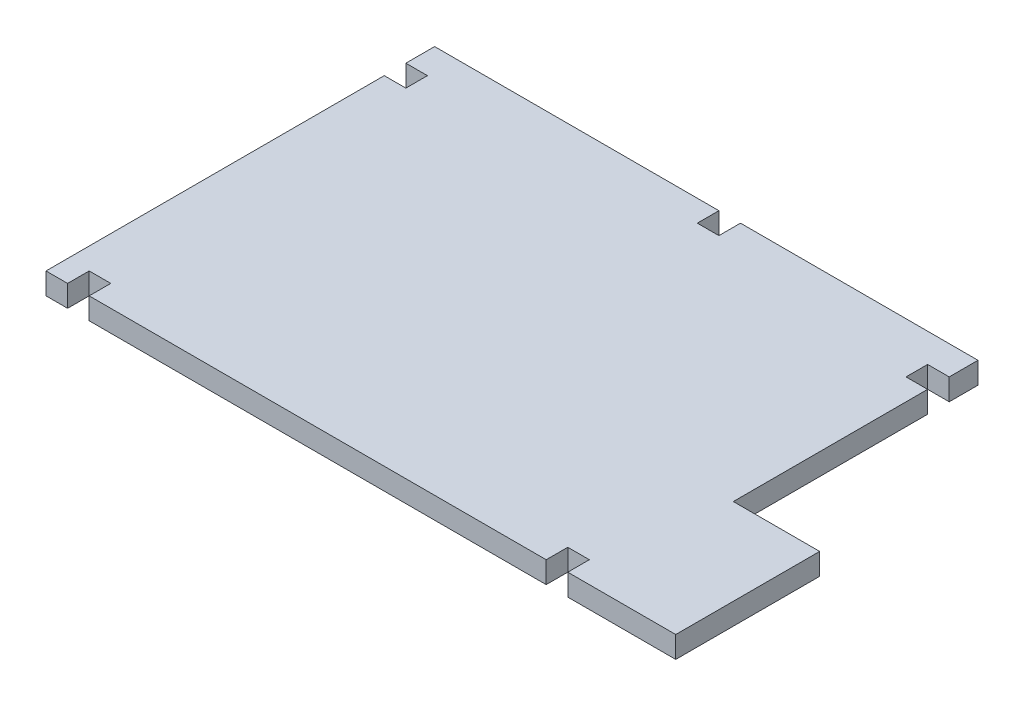
ISO-10303-21;
HEADER;
FILE_DESCRIPTION(('STEP AP214'),'2;1');
FILE_NAME('part.step','',(''),(''),'','','');
FILE_SCHEMA(('AUTOMOTIVE_DESIGN { 1 0 10303 214 1 1 1 1 }'));
ENDSEC;
DATA;
#1=APPLICATION_CONTEXT('core data for automotive mechanical design processes');
#2=APPLICATION_PROTOCOL_DEFINITION('international standard','automotive_design',2000,#1);
#3=PRODUCT_CONTEXT('',#1,'mechanical');
#4=PRODUCT('Part','Part','',(#3));
#5=PRODUCT_RELATED_PRODUCT_CATEGORY('part','',(#4));
#6=PRODUCT_DEFINITION_FORMATION('','',#4);
#7=PRODUCT_DEFINITION_CONTEXT('part definition',#1,'design');
#8=PRODUCT_DEFINITION('design','',#6,#7);
#9=PRODUCT_DEFINITION_SHAPE('','',#8);
#10=(LENGTH_UNIT() NAMED_UNIT(*) SI_UNIT(.MILLI.,.METRE.));
#11=(NAMED_UNIT(*) PLANE_ANGLE_UNIT() SI_UNIT($,.RADIAN.));
#12=(NAMED_UNIT(*) SI_UNIT($,.STERADIAN.) SOLID_ANGLE_UNIT());
#13=UNCERTAINTY_MEASURE_WITH_UNIT(LENGTH_MEASURE(1.E-05),#10,'distance_accuracy_value','');
#14=(GEOMETRIC_REPRESENTATION_CONTEXT(3) GLOBAL_UNCERTAINTY_ASSIGNED_CONTEXT((#13)) GLOBAL_UNIT_ASSIGNED_CONTEXT((#10,
#11,#12)) REPRESENTATION_CONTEXT('',''));
#15=CARTESIAN_POINT('',(0.,0.,0.));
#16=DIRECTION('',(0.,0.,1.));
#17=DIRECTION('',(1.,0.,0.));
#18=AXIS2_PLACEMENT_3D('',#15,#16,#17);
#19=CARTESIAN_POINT('',(-67.3129290115456,3.,-27.6037890560293));
#20=DIRECTION('',(0.,0.,1.));
#21=DIRECTION('',(1.,0.,0.));
#22=AXIS2_PLACEMENT_3D('',#19,#20,#21);
#23=PLANE('',#22);
#24=DIRECTION('',(-1.,0.,0.));
#25=VECTOR('',#24,1.);
#26=CARTESIAN_POINT('',(-67.3129290115456,0.,-27.6037890560293));
#27=LINE('',#26,#25);
#28=CARTESIAN_POINT('',(-27.8129290115456,0.,-27.6037890560293));
#29=VERTEX_POINT('',#28);
#30=CARTESIAN_POINT('',(-67.3129290115456,0.,-27.6037890560293));
#31=VERTEX_POINT('',#30);
#32=EDGE_CURVE('E244',#29,#31,#27,.T.);
#33=ORIENTED_EDGE('',*,*,#32,.T.);
#34=DIRECTION('',(0.,-1.,0.));
#35=VECTOR('',#34,1.);
#36=CARTESIAN_POINT('',(-67.3129290115456,3.,-27.6037890560293));
#37=LINE('',#36,#35);
#38=CARTESIAN_POINT('',(-67.3129290115456,3.,-27.6037890560293));
#39=VERTEX_POINT('',#38);
#40=EDGE_CURVE('E11',#39,#31,#37,.T.);
#41=ORIENTED_EDGE('',*,*,#40,.F.);
#42=DIRECTION('',(-1.,0.,0.));
#43=VECTOR('',#42,1.);
#44=CARTESIAN_POINT('',(-67.3129290115456,3.,-27.6037890560293));
#45=LINE('',#44,#43);
#46=CARTESIAN_POINT('',(-27.8129290115456,3.,-27.6037890560293));
#47=VERTEX_POINT('',#46);
#48=EDGE_CURVE('E293',#47,#39,#45,.T.);
#49=ORIENTED_EDGE('',*,*,#48,.F.);
#50=DIRECTION('',(0.,-1.,0.));
#51=VECTOR('',#50,1.);
#52=CARTESIAN_POINT('',(-27.8129290115456,3.,-27.6037890560293));
#53=LINE('',#52,#51);
#54=EDGE_CURVE('E241',#47,#29,#53,.T.);
#55=ORIENTED_EDGE('',*,*,#54,.T.);
#56=EDGE_LOOP('',(#33,#41,#49,#55));
#57=FACE_BOUND('',#56,.T.);
#58=ADVANCED_FACE('F41',(#57),#23,.F.);
#59=CARTESIAN_POINT('',(-67.3129290115456,3.,-27.6037890560293));
#60=DIRECTION('',(1.,0.,0.));
#61=DIRECTION('',(0.,0.,-1.));
#62=AXIS2_PLACEMENT_3D('',#59,#60,#61);
#63=PLANE('',#62);
#64=DIRECTION('',(0.,0.,1.));
#65=VECTOR('',#64,1.);
#66=CARTESIAN_POINT('',(-67.3129290115456,0.,-27.6037890560293));
#67=LINE('',#66,#65);
#68=CARTESIAN_POINT('',(-67.3129290115456,0.,-23.6037890560293));
#69=VERTEX_POINT('',#68);
#70=EDGE_CURVE('E250',#31,#69,#67,.T.);
#71=ORIENTED_EDGE('',*,*,#70,.T.);
#72=DIRECTION('',(0.,-1.,0.));
#73=VECTOR('',#72,1.);
#74=CARTESIAN_POINT('',(-67.3129290115456,3.,-23.6037890560293));
#75=LINE('',#74,#73);
#76=CARTESIAN_POINT('',(-67.3129290115456,3.,-23.6037890560293));
#77=VERTEX_POINT('',#76);
#78=EDGE_CURVE('E47',#77,#69,#75,.T.);
#79=ORIENTED_EDGE('',*,*,#78,.F.);
#80=DIRECTION('',(0.,0.,1.));
#81=VECTOR('',#80,1.);
#82=CARTESIAN_POINT('',(-67.3129290115456,3.,-27.6037890560293));
#83=LINE('',#82,#81);
#84=EDGE_CURVE('E152',#39,#77,#83,.T.);
#85=ORIENTED_EDGE('',*,*,#84,.F.);
#86=ORIENTED_EDGE('',*,*,#40,.T.);
#87=EDGE_LOOP('',(#71,#79,#85,#86));
#88=FACE_BOUND('',#87,.T.);
#89=ADVANCED_FACE('F444',(#88),#63,.F.);
#90=CARTESIAN_POINT('',(-67.3129290115456,3.,-23.6037890560293));
#91=DIRECTION('',(0.,0.,-1.));
#92=DIRECTION('',(-1.,0.,0.));
#93=AXIS2_PLACEMENT_3D('',#90,#91,#92);
#94=PLANE('',#93);
#95=DIRECTION('',(1.,0.,0.));
#96=VECTOR('',#95,1.);
#97=CARTESIAN_POINT('',(-67.3129290115456,0.,-23.6037890560293));
#98=LINE('',#97,#96);
#99=CARTESIAN_POINT('',(-64.3129290115456,0.,-23.6037890560293));
#100=VERTEX_POINT('',#99);
#101=EDGE_CURVE('E248',#69,#100,#98,.T.);
#102=ORIENTED_EDGE('',*,*,#101,.T.);
#103=DIRECTION('',(0.,-1.,0.));
#104=VECTOR('',#103,1.);
#105=CARTESIAN_POINT('',(-64.3129290115456,3.,-23.6037890560293));
#106=LINE('',#105,#104);
#107=CARTESIAN_POINT('',(-64.3129290115456,3.,-23.6037890560293));
#108=VERTEX_POINT('',#107);
#109=EDGE_CURVE('E357',#108,#100,#106,.T.);
#110=ORIENTED_EDGE('',*,*,#109,.F.);
#111=DIRECTION('',(1.,0.,0.));
#112=VECTOR('',#111,1.);
#113=CARTESIAN_POINT('',(-67.3129290115456,3.,-23.6037890560293));
#114=LINE('',#113,#112);
#115=EDGE_CURVE('E365',#77,#108,#114,.T.);
#116=ORIENTED_EDGE('',*,*,#115,.F.);
#117=ORIENTED_EDGE('',*,*,#78,.T.);
#118=EDGE_LOOP('',(#102,#110,#116,#117));
#119=FACE_BOUND('',#118,.T.);
#120=ADVANCED_FACE('F362',(#119),#94,.F.);
#121=CARTESIAN_POINT('',(-64.3129290115456,3.,-23.6037890560293));
#122=DIRECTION('',(1.,0.,0.));
#123=DIRECTION('',(0.,0.,-1.));
#124=AXIS2_PLACEMENT_3D('',#121,#122,#123);
#125=PLANE('',#124);
#126=DIRECTION('',(0.,0.,1.));
#127=VECTOR('',#126,1.);
#128=CARTESIAN_POINT('',(-64.3129290115456,0.,-23.6037890560293));
#129=LINE('',#128,#127);
#130=CARTESIAN_POINT('',(-64.3129290115456,0.,-20.6037890560293));
#131=VERTEX_POINT('',#130);
#132=EDGE_CURVE('E252',#100,#131,#129,.T.);
#133=ORIENTED_EDGE('',*,*,#132,.T.);
#134=DIRECTION('',(0.,-1.,0.));
#135=VECTOR('',#134,1.);
#136=CARTESIAN_POINT('',(-64.3129290115456,3.,-20.6037890560293));
#137=LINE('',#136,#135);
#138=CARTESIAN_POINT('',(-64.3129290115456,3.,-20.6037890560293));
#139=VERTEX_POINT('',#138);
#140=EDGE_CURVE('E352',#139,#131,#137,.T.);
#141=ORIENTED_EDGE('',*,*,#140,.F.);
#142=DIRECTION('',(0.,0.,1.));
#143=VECTOR('',#142,1.);
#144=CARTESIAN_POINT('',(-64.3129290115456,3.,-23.6037890560293));
#145=LINE('',#144,#143);
#146=EDGE_CURVE('E385',#108,#139,#145,.T.);
#147=ORIENTED_EDGE('',*,*,#146,.F.);
#148=ORIENTED_EDGE('',*,*,#109,.T.);
#149=EDGE_LOOP('',(#133,#141,#147,#148));
#150=FACE_BOUND('',#149,.T.);
#151=ADVANCED_FACE('F373',(#150),#125,.F.);
#152=CARTESIAN_POINT('',(-64.3129290115456,3.,-20.6037890560293));
#153=DIRECTION('',(0.,0.,1.));
#154=DIRECTION('',(1.,0.,0.));
#155=AXIS2_PLACEMENT_3D('',#152,#153,#154);
#156=PLANE('',#155);
#157=DIRECTION('',(-1.,0.,0.));
#158=VECTOR('',#157,1.);
#159=CARTESIAN_POINT('',(-64.3129290115456,0.,-20.6037890560293));
#160=LINE('',#159,#158);
#161=CARTESIAN_POINT('',(-67.3129290115456,0.,-20.6037890560293));
#162=VERTEX_POINT('',#161);
#163=EDGE_CURVE('E255',#131,#162,#160,.T.);
#164=ORIENTED_EDGE('',*,*,#163,.T.);
#165=DIRECTION('',(0.,-1.,0.));
#166=VECTOR('',#165,1.);
#167=CARTESIAN_POINT('',(-67.3129290115456,3.,-20.6037890560293));
#168=LINE('',#167,#166);
#169=CARTESIAN_POINT('',(-67.3129290115456,3.,-20.6037890560293));
#170=VERTEX_POINT('',#169);
#171=EDGE_CURVE('E348',#170,#162,#168,.T.);
#172=ORIENTED_EDGE('',*,*,#171,.F.);
#173=DIRECTION('',(-1.,0.,0.));
#174=VECTOR('',#173,1.);
#175=CARTESIAN_POINT('',(-64.3129290115456,3.,-20.6037890560293));
#176=LINE('',#175,#174);
#177=EDGE_CURVE('E377',#139,#170,#176,.T.);
#178=ORIENTED_EDGE('',*,*,#177,.F.);
#179=ORIENTED_EDGE('',*,*,#140,.T.);
#180=EDGE_LOOP('',(#164,#172,#178,#179));
#181=FACE_BOUND('',#180,.T.);
#182=ADVANCED_FACE('F380',(#181),#156,.F.);
#183=CARTESIAN_POINT('',(-67.3129290115456,3.,-20.6037890560293));
#184=DIRECTION('',(1.,0.,0.));
#185=DIRECTION('',(0.,0.,-1.));
#186=AXIS2_PLACEMENT_3D('',#183,#184,#185);
#187=PLANE('',#186);
#188=DIRECTION('',(0.,0.,1.));
#189=VECTOR('',#188,1.);
#190=CARTESIAN_POINT('',(-67.3129290115456,0.,-20.6037890560293));
#191=LINE('',#190,#189);
#192=CARTESIAN_POINT('',(-67.3129290115456,0.,26.3962109439707));
#193=VERTEX_POINT('',#192);
#194=EDGE_CURVE('E258',#162,#193,#191,.T.);
#195=ORIENTED_EDGE('',*,*,#194,.T.);
#196=DIRECTION('',(0.,-1.,0.));
#197=VECTOR('',#196,1.);
#198=CARTESIAN_POINT('',(-67.3129290115456,3.,26.3962109439707));
#199=LINE('',#198,#197);
#200=CARTESIAN_POINT('',(-67.3129290115456,3.,26.3962109439707));
#201=VERTEX_POINT('',#200);
#202=EDGE_CURVE('E350',#201,#193,#199,.T.);
#203=ORIENTED_EDGE('',*,*,#202,.F.);
#204=DIRECTION('',(0.,0.,1.));
#205=VECTOR('',#204,1.);
#206=CARTESIAN_POINT('',(-67.3129290115456,3.,-20.6037890560293));
#207=LINE('',#206,#205);
#208=EDGE_CURVE('E381',#170,#201,#207,.T.);
#209=ORIENTED_EDGE('',*,*,#208,.F.);
#210=ORIENTED_EDGE('',*,*,#171,.T.);
#211=EDGE_LOOP('',(#195,#203,#209,#210));
#212=FACE_BOUND('',#211,.T.);
#213=ADVANCED_FACE('F457',(#212),#187,.F.);
#214=CARTESIAN_POINT('',(-67.3129290115456,3.,26.3962109439707));
#215=DIRECTION('',(0.,0.,-1.));
#216=DIRECTION('',(-1.,0.,0.));
#217=AXIS2_PLACEMENT_3D('',#214,#215,#216);
#218=PLANE('',#217);
#219=DIRECTION('',(1.,0.,0.));
#220=VECTOR('',#219,1.);
#221=CARTESIAN_POINT('',(-67.3129290115456,0.,26.3962109439707));
#222=LINE('',#221,#220);
#223=CARTESIAN_POINT('',(-64.3129290115456,0.,26.3962109439707));
#224=VERTEX_POINT('',#223);
#225=EDGE_CURVE('E256',#193,#224,#222,.T.);
#226=ORIENTED_EDGE('',*,*,#225,.T.);
#227=DIRECTION('',(0.,-1.,0.));
#228=VECTOR('',#227,1.);
#229=CARTESIAN_POINT('',(-64.3129290115456,3.,26.3962109439707));
#230=LINE('',#229,#228);
#231=CARTESIAN_POINT('',(-64.3129290115456,3.,26.3962109439707));
#232=VERTEX_POINT('',#231);
#233=EDGE_CURVE('E341',#232,#224,#230,.T.);
#234=ORIENTED_EDGE('',*,*,#233,.F.);
#235=DIRECTION('',(1.,0.,0.));
#236=VECTOR('',#235,1.);
#237=CARTESIAN_POINT('',(-67.3129290115456,3.,26.3962109439707));
#238=LINE('',#237,#236);
#239=EDGE_CURVE('E383',#201,#232,#238,.T.);
#240=ORIENTED_EDGE('',*,*,#239,.F.);
#241=ORIENTED_EDGE('',*,*,#202,.T.);
#242=EDGE_LOOP('',(#226,#234,#240,#241));
#243=FACE_BOUND('',#242,.T.);
#244=ADVANCED_FACE('F459',(#243),#218,.F.);
#245=CARTESIAN_POINT('',(-64.3129290115456,3.,26.3962109439707));
#246=DIRECTION('',(-1.,0.,0.));
#247=DIRECTION('',(0.,0.,1.));
#248=AXIS2_PLACEMENT_3D('',#245,#246,#247);
#249=PLANE('',#248);
#250=DIRECTION('',(0.,0.,-1.));
#251=VECTOR('',#250,1.);
#252=CARTESIAN_POINT('',(-64.3129290115456,0.,26.3962109439707));
#253=LINE('',#252,#251);
#254=CARTESIAN_POINT('',(-64.3129290115456,0.,23.3962109439707));
#255=VERTEX_POINT('',#254);
#256=EDGE_CURVE('E257',#224,#255,#253,.T.);
#257=ORIENTED_EDGE('',*,*,#256,.T.);
#258=DIRECTION('',(0.,-1.,0.));
#259=VECTOR('',#258,1.);
#260=CARTESIAN_POINT('',(-64.3129290115456,3.,23.3962109439707));
#261=LINE('',#260,#259);
#262=CARTESIAN_POINT('',(-64.3129290115456,3.,23.3962109439707));
#263=VERTEX_POINT('',#262);
#264=EDGE_CURVE('E342',#263,#255,#261,.T.);
#265=ORIENTED_EDGE('',*,*,#264,.F.);
#266=DIRECTION('',(0.,0.,-1.));
#267=VECTOR('',#266,1.);
#268=CARTESIAN_POINT('',(-64.3129290115456,3.,26.3962109439707));
#269=LINE('',#268,#267);
#270=EDGE_CURVE('E388',#232,#263,#269,.T.);
#271=ORIENTED_EDGE('',*,*,#270,.F.);
#272=ORIENTED_EDGE('',*,*,#233,.T.);
#273=EDGE_LOOP('',(#257,#265,#271,#272));
#274=FACE_BOUND('',#273,.T.);
#275=ADVANCED_FACE('F462',(#274),#249,.F.);
#276=CARTESIAN_POINT('',(-64.3129290115456,3.,23.3962109439707));
#277=DIRECTION('',(0.,0.,-1.));
#278=DIRECTION('',(-1.,0.,0.));
#279=AXIS2_PLACEMENT_3D('',#276,#277,#278);
#280=PLANE('',#279);
#281=DIRECTION('',(1.,0.,0.));
#282=VECTOR('',#281,1.);
#283=CARTESIAN_POINT('',(-64.3129290115456,0.,23.3962109439707));
#284=LINE('',#283,#282);
#285=CARTESIAN_POINT('',(-61.3129290115456,0.,23.3962109439707));
#286=VERTEX_POINT('',#285);
#287=EDGE_CURVE('E265',#255,#286,#284,.T.);
#288=ORIENTED_EDGE('',*,*,#287,.T.);
#289=DIRECTION('',(0.,-1.,0.));
#290=VECTOR('',#289,1.);
#291=CARTESIAN_POINT('',(-61.3129290115456,3.,23.3962109439707));
#292=LINE('',#291,#290);
#293=CARTESIAN_POINT('',(-61.3129290115456,3.,23.3962109439707));
#294=VERTEX_POINT('',#293);
#295=EDGE_CURVE('E337',#294,#286,#292,.T.);
#296=ORIENTED_EDGE('',*,*,#295,.F.);
#297=DIRECTION('',(1.,0.,0.));
#298=VECTOR('',#297,1.);
#299=CARTESIAN_POINT('',(-64.3129290115456,3.,23.3962109439707));
#300=LINE('',#299,#298);
#301=EDGE_CURVE('E395',#263,#294,#300,.T.);
#302=ORIENTED_EDGE('',*,*,#301,.F.);
#303=ORIENTED_EDGE('',*,*,#264,.T.);
#304=EDGE_LOOP('',(#288,#296,#302,#303));
#305=FACE_BOUND('',#304,.T.);
#306=ADVANCED_FACE('F469',(#305),#280,.F.);
#307=CARTESIAN_POINT('',(-61.3129290115456,3.,23.3962109439707));
#308=DIRECTION('',(1.,0.,0.));
#309=DIRECTION('',(0.,0.,-1.));
#310=AXIS2_PLACEMENT_3D('',#307,#308,#309);
#311=PLANE('',#310);
#312=DIRECTION('',(0.,0.,1.));
#313=VECTOR('',#312,1.);
#314=CARTESIAN_POINT('',(-61.3129290115456,0.,23.3962109439707));
#315=LINE('',#314,#313);
#316=CARTESIAN_POINT('',(-61.3129290115456,0.,26.3962109439707));
#317=VERTEX_POINT('',#316);
#318=EDGE_CURVE('E262',#286,#317,#315,.T.);
#319=ORIENTED_EDGE('',*,*,#318,.T.);
#320=DIRECTION('',(0.,-1.,0.));
#321=VECTOR('',#320,1.);
#322=CARTESIAN_POINT('',(-61.3129290115456,3.,26.3962109439707));
#323=LINE('',#322,#321);
#324=CARTESIAN_POINT('',(-61.3129290115456,3.,26.3962109439707));
#325=VERTEX_POINT('',#324);
#326=EDGE_CURVE('E333',#325,#317,#323,.T.);
#327=ORIENTED_EDGE('',*,*,#326,.F.);
#328=DIRECTION('',(0.,0.,1.));
#329=VECTOR('',#328,1.);
#330=CARTESIAN_POINT('',(-61.3129290115456,3.,23.3962109439707));
#331=LINE('',#330,#329);
#332=EDGE_CURVE('E393',#294,#325,#331,.T.);
#333=ORIENTED_EDGE('',*,*,#332,.F.);
#334=ORIENTED_EDGE('',*,*,#295,.T.);
#335=EDGE_LOOP('',(#319,#327,#333,#334));
#336=FACE_BOUND('',#335,.T.);
#337=ADVANCED_FACE('F473',(#336),#311,.F.);
#338=CARTESIAN_POINT('',(-61.3129290115456,3.,26.3962109439707));
#339=DIRECTION('',(0.,0.,-1.));
#340=DIRECTION('',(-1.,0.,0.));
#341=AXIS2_PLACEMENT_3D('',#338,#339,#340);
#342=PLANE('',#341);
#343=DIRECTION('',(1.,0.,0.));
#344=VECTOR('',#343,1.);
#345=CARTESIAN_POINT('',(-61.3129290115456,0.,26.3962109439707));
#346=LINE('',#345,#344);
#347=CARTESIAN_POINT('',(2.18707098845444,0.,26.3962109439707));
#348=VERTEX_POINT('',#347);
#349=EDGE_CURVE('E266',#317,#348,#346,.T.);
#350=ORIENTED_EDGE('',*,*,#349,.T.);
#351=DIRECTION('',(0.,-1.,0.));
#352=VECTOR('',#351,1.);
#353=CARTESIAN_POINT('',(2.18707098845444,3.,26.3962109439707));
#354=LINE('',#353,#352);
#355=CARTESIAN_POINT('',(2.18707098845444,3.,26.3962109439707));
#356=VERTEX_POINT('',#355);
#357=EDGE_CURVE('E335',#356,#348,#354,.T.);
#358=ORIENTED_EDGE('',*,*,#357,.F.);
#359=DIRECTION('',(1.,0.,0.));
#360=VECTOR('',#359,1.);
#361=CARTESIAN_POINT('',(-61.3129290115456,3.,26.3962109439707));
#362=LINE('',#361,#360);
#363=EDGE_CURVE('E397',#325,#356,#362,.T.);
#364=ORIENTED_EDGE('',*,*,#363,.F.);
#365=ORIENTED_EDGE('',*,*,#326,.T.);
#366=EDGE_LOOP('',(#350,#358,#364,#365));
#367=FACE_BOUND('',#366,.T.);
#368=ADVANCED_FACE('F474',(#367),#342,.F.);
#369=CARTESIAN_POINT('',(2.18707098845444,3.,26.3962109439707));
#370=DIRECTION('',(-1.,0.,0.));
#371=DIRECTION('',(0.,0.,1.));
#372=AXIS2_PLACEMENT_3D('',#369,#370,#371);
#373=PLANE('',#372);
#374=DIRECTION('',(0.,0.,-1.));
#375=VECTOR('',#374,1.);
#376=CARTESIAN_POINT('',(2.18707098845444,0.,26.3962109439707));
#377=LINE('',#376,#375);
#378=CARTESIAN_POINT('',(2.18707098845444,0.,23.3962109439707));
#379=VERTEX_POINT('',#378);
#380=EDGE_CURVE('E268',#348,#379,#377,.T.);
#381=ORIENTED_EDGE('',*,*,#380,.T.);
#382=DIRECTION('',(0.,-1.,0.));
#383=VECTOR('',#382,1.);
#384=CARTESIAN_POINT('',(2.18707098845444,3.,23.3962109439707));
#385=LINE('',#384,#383);
#386=CARTESIAN_POINT('',(2.18707098845444,3.,23.3962109439707));
#387=VERTEX_POINT('',#386);
#388=EDGE_CURVE('E328',#387,#379,#385,.T.);
#389=ORIENTED_EDGE('',*,*,#388,.F.);
#390=DIRECTION('',(0.,0.,-1.));
#391=VECTOR('',#390,1.);
#392=CARTESIAN_POINT('',(2.18707098845444,3.,26.3962109439707));
#393=LINE('',#392,#391);
#394=EDGE_CURVE('E400',#356,#387,#393,.T.);
#395=ORIENTED_EDGE('',*,*,#394,.F.);
#396=ORIENTED_EDGE('',*,*,#357,.T.);
#397=EDGE_LOOP('',(#381,#389,#395,#396));
#398=FACE_BOUND('',#397,.T.);
#399=ADVANCED_FACE('F479',(#398),#373,.F.);
#400=CARTESIAN_POINT('',(2.18707098845444,3.,23.3962109439707));
#401=DIRECTION('',(0.,0.,-1.));
#402=DIRECTION('',(-1.,0.,0.));
#403=AXIS2_PLACEMENT_3D('',#400,#401,#402);
#404=PLANE('',#403);
#405=DIRECTION('',(1.,0.,0.));
#406=VECTOR('',#405,1.);
#407=CARTESIAN_POINT('',(2.18707098845444,0.,23.3962109439707));
#408=LINE('',#407,#406);
#409=CARTESIAN_POINT('',(5.18707098845444,0.,23.3962109439707));
#410=VERTEX_POINT('',#409);
#411=EDGE_CURVE('E269',#379,#410,#408,.T.);
#412=ORIENTED_EDGE('',*,*,#411,.T.);
#413=DIRECTION('',(0.,-1.,0.));
#414=VECTOR('',#413,1.);
#415=CARTESIAN_POINT('',(5.18707098845444,3.,23.3962109439707));
#416=LINE('',#415,#414);
#417=CARTESIAN_POINT('',(5.18707098845444,3.,23.3962109439707));
#418=VERTEX_POINT('',#417);
#419=EDGE_CURVE('E326',#418,#410,#416,.T.);
#420=ORIENTED_EDGE('',*,*,#419,.F.);
#421=DIRECTION('',(1.,0.,0.));
#422=VECTOR('',#421,1.);
#423=CARTESIAN_POINT('',(2.18707098845444,3.,23.3962109439707));
#424=LINE('',#423,#422);
#425=EDGE_CURVE('E398',#387,#418,#424,.T.);
#426=ORIENTED_EDGE('',*,*,#425,.F.);
#427=ORIENTED_EDGE('',*,*,#388,.T.);
#428=EDGE_LOOP('',(#412,#420,#426,#427));
#429=FACE_BOUND('',#428,.T.);
#430=ADVANCED_FACE('F483',(#429),#404,.F.);
#431=CARTESIAN_POINT('',(5.18707098845444,3.,23.3962109439707));
#432=DIRECTION('',(1.,0.,0.));
#433=DIRECTION('',(0.,0.,-1.));
#434=AXIS2_PLACEMENT_3D('',#431,#432,#433);
#435=PLANE('',#434);
#436=DIRECTION('',(0.,0.,1.));
#437=VECTOR('',#436,1.);
#438=CARTESIAN_POINT('',(5.18707098845444,0.,23.3962109439707));
#439=LINE('',#438,#437);
#440=CARTESIAN_POINT('',(5.18707098845444,0.,26.3962109439707));
#441=VERTEX_POINT('',#440);
#442=EDGE_CURVE('E275',#410,#441,#439,.T.);
#443=ORIENTED_EDGE('',*,*,#442,.T.);
#444=DIRECTION('',(0.,-1.,0.));
#445=VECTOR('',#444,1.);
#446=CARTESIAN_POINT('',(5.18707098845444,3.,26.3962109439707));
#447=LINE('',#446,#445);
#448=CARTESIAN_POINT('',(5.18707098845444,3.,26.3962109439707));
#449=VERTEX_POINT('',#448);
#450=EDGE_CURVE('E323',#449,#441,#447,.T.);
#451=ORIENTED_EDGE('',*,*,#450,.F.);
#452=DIRECTION('',(0.,0.,1.));
#453=VECTOR('',#452,1.);
#454=CARTESIAN_POINT('',(5.18707098845444,3.,23.3962109439707));
#455=LINE('',#454,#453);
#456=EDGE_CURVE('E405',#418,#449,#455,.T.);
#457=ORIENTED_EDGE('',*,*,#456,.F.);
#458=ORIENTED_EDGE('',*,*,#419,.T.);
#459=EDGE_LOOP('',(#443,#451,#457,#458));
#460=FACE_BOUND('',#459,.T.);
#461=ADVANCED_FACE('F490',(#460),#435,.F.);
#462=CARTESIAN_POINT('',(5.18707098845444,3.,26.3962109439707));
#463=DIRECTION('',(0.,0.,-1.));
#464=DIRECTION('',(-1.,0.,0.));
#465=AXIS2_PLACEMENT_3D('',#462,#463,#464);
#466=PLANE('',#465);
#467=DIRECTION('',(1.,0.,0.));
#468=VECTOR('',#467,1.);
#469=CARTESIAN_POINT('',(5.18707098845444,0.,26.3962109439707));
#470=LINE('',#469,#468);
#471=CARTESIAN_POINT('',(20.1870709884544,0.,26.3962109439707));
#472=VERTEX_POINT('',#471);
#473=EDGE_CURVE('E273',#441,#472,#470,.T.);
#474=ORIENTED_EDGE('',*,*,#473,.T.);
#475=DIRECTION('',(0.,-1.,0.));
#476=VECTOR('',#475,1.);
#477=CARTESIAN_POINT('',(20.1870709884544,3.,26.3962109439707));
#478=LINE('',#477,#476);
#479=CARTESIAN_POINT('',(20.1870709884544,3.,26.3962109439707));
#480=VERTEX_POINT('',#479);
#481=EDGE_CURVE('E319',#480,#472,#478,.T.);
#482=ORIENTED_EDGE('',*,*,#481,.F.);
#483=DIRECTION('',(1.,0.,0.));
#484=VECTOR('',#483,1.);
#485=CARTESIAN_POINT('',(5.18707098845444,3.,26.3962109439707));
#486=LINE('',#485,#484);
#487=EDGE_CURVE('E404',#449,#480,#486,.T.);
#488=ORIENTED_EDGE('',*,*,#487,.F.);
#489=ORIENTED_EDGE('',*,*,#450,.T.);
#490=EDGE_LOOP('',(#474,#482,#488,#489));
#491=FACE_BOUND('',#490,.T.);
#492=ADVANCED_FACE('F491',(#491),#466,.F.);
#493=CARTESIAN_POINT('',(20.1870709884544,3.,26.3962109439707));
#494=DIRECTION('',(-1.,0.,0.));
#495=DIRECTION('',(0.,0.,1.));
#496=AXIS2_PLACEMENT_3D('',#493,#494,#495);
#497=PLANE('',#496);
#498=DIRECTION('',(0.,0.,-1.));
#499=VECTOR('',#498,1.);
#500=CARTESIAN_POINT('',(20.1870709884544,0.,26.3962109439707));
#501=LINE('',#500,#499);
#502=CARTESIAN_POINT('',(20.1870709884544,0.,6.39621094397072));
#503=VERTEX_POINT('',#502);
#504=EDGE_CURVE('E277',#472,#503,#501,.T.);
#505=ORIENTED_EDGE('',*,*,#504,.T.);
#506=DIRECTION('',(0.,-1.,0.));
#507=VECTOR('',#506,1.);
#508=CARTESIAN_POINT('',(20.1870709884544,3.,6.39621094397072));
#509=LINE('',#508,#507);
#510=CARTESIAN_POINT('',(20.1870709884544,3.,6.39621094397072));
#511=VERTEX_POINT('',#510);
#512=EDGE_CURVE('E320',#511,#503,#509,.T.);
#513=ORIENTED_EDGE('',*,*,#512,.F.);
#514=DIRECTION('',(0.,0.,-1.));
#515=VECTOR('',#514,1.);
#516=CARTESIAN_POINT('',(20.1870709884544,3.,26.3962109439707));
#517=LINE('',#516,#515);
#518=EDGE_CURVE('E406',#480,#511,#517,.T.);
#519=ORIENTED_EDGE('',*,*,#518,.F.);
#520=ORIENTED_EDGE('',*,*,#481,.T.);
#521=EDGE_LOOP('',(#505,#513,#519,#520));
#522=FACE_BOUND('',#521,.T.);
#523=ADVANCED_FACE('F494',(#522),#497,.F.);
#524=CARTESIAN_POINT('',(8.18707098845444,3.,6.39621094397072));
#525=DIRECTION('',(0.,0.,1.));
#526=DIRECTION('',(1.,0.,0.));
#527=AXIS2_PLACEMENT_3D('',#524,#525,#526);
#528=PLANE('',#527);
#529=DIRECTION('',(-1.,0.,0.));
#530=VECTOR('',#529,1.);
#531=CARTESIAN_POINT('',(8.18707098845444,0.,6.39621094397072));
#532=LINE('',#531,#530);
#533=CARTESIAN_POINT('',(8.18707098845444,0.,6.39621094397072));
#534=VERTEX_POINT('',#533);
#535=EDGE_CURVE('E279',#503,#534,#532,.T.);
#536=ORIENTED_EDGE('',*,*,#535,.T.);
#537=DIRECTION('',(0.,-1.,0.));
#538=VECTOR('',#537,1.);
#539=CARTESIAN_POINT('',(8.18707098845444,3.,6.39621094397072));
#540=LINE('',#539,#538);
#541=CARTESIAN_POINT('',(8.18707098845444,3.,6.39621094397072));
#542=VERTEX_POINT('',#541);
#543=EDGE_CURVE('E314',#542,#534,#540,.T.);
#544=ORIENTED_EDGE('',*,*,#543,.F.);
#545=DIRECTION('',(-1.,0.,0.));
#546=VECTOR('',#545,1.);
#547=CARTESIAN_POINT('',(8.18707098845444,3.,6.39621094397072));
#548=LINE('',#547,#546);
#549=EDGE_CURVE('E407',#511,#542,#548,.T.);
#550=ORIENTED_EDGE('',*,*,#549,.F.);
#551=ORIENTED_EDGE('',*,*,#512,.T.);
#552=EDGE_LOOP('',(#536,#544,#550,#551));
#553=FACE_BOUND('',#552,.T.);
#554=ADVANCED_FACE('F496',(#553),#528,.F.);
#555=CARTESIAN_POINT('',(8.18707098845444,3.,-20.6037890560293));
#556=DIRECTION('',(-1.,0.,0.));
#557=DIRECTION('',(0.,0.,1.));
#558=AXIS2_PLACEMENT_3D('',#555,#556,#557);
#559=PLANE('',#558);
#560=DIRECTION('',(0.,0.,-1.));
#561=VECTOR('',#560,1.);
#562=CARTESIAN_POINT('',(8.18707098845444,0.,-20.6037890560293));
#563=LINE('',#562,#561);
#564=CARTESIAN_POINT('',(8.18707098845444,0.,-20.6037890560293));
#565=VERTEX_POINT('',#564);
#566=EDGE_CURVE('E278',#534,#565,#563,.T.);
#567=ORIENTED_EDGE('',*,*,#566,.T.);
#568=DIRECTION('',(0.,-1.,0.));
#569=VECTOR('',#568,1.);
#570=CARTESIAN_POINT('',(8.18707098845444,3.,-20.6037890560293));
#571=LINE('',#570,#569);
#572=CARTESIAN_POINT('',(8.18707098845444,3.,-20.6037890560293));
#573=VERTEX_POINT('',#572);
#574=EDGE_CURVE('E313',#573,#565,#571,.T.);
#575=ORIENTED_EDGE('',*,*,#574,.F.);
#576=DIRECTION('',(0.,0.,-1.));
#577=VECTOR('',#576,1.);
#578=CARTESIAN_POINT('',(8.18707098845444,3.,-20.6037890560293));
#579=LINE('',#578,#577);
#580=EDGE_CURVE('E409',#542,#573,#579,.T.);
#581=ORIENTED_EDGE('',*,*,#580,.F.);
#582=ORIENTED_EDGE('',*,*,#543,.T.);
#583=EDGE_LOOP('',(#567,#575,#581,#582));
#584=FACE_BOUND('',#583,.T.);
#585=ADVANCED_FACE('F502',(#584),#559,.F.);
#586=CARTESIAN_POINT('',(5.18707098845444,3.,-20.6037890560293));
#587=DIRECTION('',(0.,0.,1.));
#588=DIRECTION('',(1.,0.,0.));
#589=AXIS2_PLACEMENT_3D('',#586,#587,#588);
#590=PLANE('',#589);
#591=DIRECTION('',(-1.,0.,0.));
#592=VECTOR('',#591,1.);
#593=CARTESIAN_POINT('',(5.18707098845444,0.,-20.6037890560293));
#594=LINE('',#593,#592);
#595=CARTESIAN_POINT('',(5.18707098845444,0.,-20.6037890560293));
#596=VERTEX_POINT('',#595);
#597=EDGE_CURVE('E285',#565,#596,#594,.T.);
#598=ORIENTED_EDGE('',*,*,#597,.T.);
#599=DIRECTION('',(0.,-1.,0.));
#600=VECTOR('',#599,1.);
#601=CARTESIAN_POINT('',(5.18707098845444,3.,-20.6037890560293));
#602=LINE('',#601,#600);
#603=CARTESIAN_POINT('',(5.18707098845444,3.,-20.6037890560293));
#604=VERTEX_POINT('',#603);
#605=EDGE_CURVE('E306',#604,#596,#602,.T.);
#606=ORIENTED_EDGE('',*,*,#605,.F.);
#607=DIRECTION('',(-1.,0.,0.));
#608=VECTOR('',#607,1.);
#609=CARTESIAN_POINT('',(5.18707098845444,3.,-20.6037890560293));
#610=LINE('',#609,#608);
#611=EDGE_CURVE('E414',#573,#604,#610,.T.);
#612=ORIENTED_EDGE('',*,*,#611,.F.);
#613=ORIENTED_EDGE('',*,*,#574,.T.);
#614=EDGE_LOOP('',(#598,#606,#612,#613));
#615=FACE_BOUND('',#614,.T.);
#616=ADVANCED_FACE('F509',(#615),#590,.F.);
#617=CARTESIAN_POINT('',(5.18707098845444,3.,-23.6037890560293));
#618=DIRECTION('',(-1.,0.,0.));
#619=DIRECTION('',(0.,0.,1.));
#620=AXIS2_PLACEMENT_3D('',#617,#618,#619);
#621=PLANE('',#620);
#622=DIRECTION('',(0.,0.,-1.));
#623=VECTOR('',#622,1.);
#624=CARTESIAN_POINT('',(5.18707098845444,0.,-23.6037890560293));
#625=LINE('',#624,#623);
#626=CARTESIAN_POINT('',(5.18707098845444,0.,-23.6037890560293));
#627=VERTEX_POINT('',#626);
#628=EDGE_CURVE('E283',#596,#627,#625,.T.);
#629=ORIENTED_EDGE('',*,*,#628,.T.);
#630=DIRECTION('',(0.,-1.,0.));
#631=VECTOR('',#630,1.);
#632=CARTESIAN_POINT('',(5.18707098845444,3.,-23.6037890560293));
#633=LINE('',#632,#631);
#634=CARTESIAN_POINT('',(5.18707098845444,3.,-23.6037890560293));
#635=VERTEX_POINT('',#634);
#636=EDGE_CURVE('E303',#635,#627,#633,.T.);
#637=ORIENTED_EDGE('',*,*,#636,.F.);
#638=DIRECTION('',(0.,0.,-1.));
#639=VECTOR('',#638,1.);
#640=CARTESIAN_POINT('',(5.18707098845444,3.,-23.6037890560293));
#641=LINE('',#640,#639);
#642=EDGE_CURVE('E411',#604,#635,#641,.T.);
#643=ORIENTED_EDGE('',*,*,#642,.F.);
#644=ORIENTED_EDGE('',*,*,#605,.T.);
#645=EDGE_LOOP('',(#629,#637,#643,#644));
#646=FACE_BOUND('',#645,.T.);
#647=ADVANCED_FACE('F512',(#646),#621,.F.);
#648=CARTESIAN_POINT('',(8.18707098845444,3.,-23.6037890560293));
#649=DIRECTION('',(0.,0.,-1.));
#650=DIRECTION('',(-1.,0.,0.));
#651=AXIS2_PLACEMENT_3D('',#648,#649,#650);
#652=PLANE('',#651);
#653=DIRECTION('',(1.,0.,0.));
#654=VECTOR('',#653,1.);
#655=CARTESIAN_POINT('',(8.18707098845444,0.,-23.6037890560293));
#656=LINE('',#655,#654);
#657=CARTESIAN_POINT('',(8.18707098845444,0.,-23.6037890560293));
#658=VERTEX_POINT('',#657);
#659=EDGE_CURVE('E287',#627,#658,#656,.T.);
#660=ORIENTED_EDGE('',*,*,#659,.T.);
#661=DIRECTION('',(0.,-1.,0.));
#662=VECTOR('',#661,1.);
#663=CARTESIAN_POINT('',(8.18707098845444,3.,-23.6037890560293));
#664=LINE('',#663,#662);
#665=CARTESIAN_POINT('',(8.18707098845444,3.,-23.6037890560293));
#666=VERTEX_POINT('',#665);
#667=EDGE_CURVE('E304',#666,#658,#664,.T.);
#668=ORIENTED_EDGE('',*,*,#667,.F.);
#669=DIRECTION('',(1.,0.,0.));
#670=VECTOR('',#669,1.);
#671=CARTESIAN_POINT('',(8.18707098845444,3.,-23.6037890560293));
#672=LINE('',#671,#670);
#673=EDGE_CURVE('E418',#635,#666,#672,.T.);
#674=ORIENTED_EDGE('',*,*,#673,.F.);
#675=ORIENTED_EDGE('',*,*,#636,.T.);
#676=EDGE_LOOP('',(#660,#668,#674,#675));
#677=FACE_BOUND('',#676,.T.);
#678=ADVANCED_FACE('F513',(#677),#652,.F.);
#679=CARTESIAN_POINT('',(8.18707098845444,3.,-27.6037890560293));
#680=DIRECTION('',(-1.,0.,0.));
#681=DIRECTION('',(0.,0.,1.));
#682=AXIS2_PLACEMENT_3D('',#679,#680,#681);
#683=PLANE('',#682);
#684=DIRECTION('',(0.,0.,-1.));
#685=VECTOR('',#684,1.);
#686=CARTESIAN_POINT('',(8.18707098845444,0.,-27.6037890560293));
#687=LINE('',#686,#685);
#688=CARTESIAN_POINT('',(8.18707098845444,0.,-27.6037890560293));
#689=VERTEX_POINT('',#688);
#690=EDGE_CURVE('E290',#658,#689,#687,.T.);
#691=ORIENTED_EDGE('',*,*,#690,.T.);
#692=DIRECTION('',(0.,-1.,0.));
#693=VECTOR('',#692,1.);
#694=CARTESIAN_POINT('',(8.18707098845444,3.,-27.6037890560293));
#695=LINE('',#694,#693);
#696=CARTESIAN_POINT('',(8.18707098845444,3.,-27.6037890560293));
#697=VERTEX_POINT('',#696);
#698=EDGE_CURVE('E298',#697,#689,#695,.T.);
#699=ORIENTED_EDGE('',*,*,#698,.F.);
#700=DIRECTION('',(0.,0.,-1.));
#701=VECTOR('',#700,1.);
#702=CARTESIAN_POINT('',(8.18707098845444,3.,-27.6037890560293));
#703=LINE('',#702,#701);
#704=EDGE_CURVE('E416',#666,#697,#703,.T.);
#705=ORIENTED_EDGE('',*,*,#704,.F.);
#706=ORIENTED_EDGE('',*,*,#667,.T.);
#707=EDGE_LOOP('',(#691,#699,#705,#706));
#708=FACE_BOUND('',#707,.T.);
#709=ADVANCED_FACE('F424',(#708),#683,.F.);
#710=CARTESIAN_POINT('',(-24.8129290115456,3.,-27.6037890560293));
#711=DIRECTION('',(0.,0.,1.));
#712=DIRECTION('',(1.,0.,0.));
#713=AXIS2_PLACEMENT_3D('',#710,#711,#712);
#714=PLANE('',#713);
#715=DIRECTION('',(-1.,0.,0.));
#716=VECTOR('',#715,1.);
#717=CARTESIAN_POINT('',(-24.8129290115456,0.,-27.6037890560293));
#718=LINE('',#717,#716);
#719=CARTESIAN_POINT('',(-24.8129290115456,0.,-27.6037890560293));
#720=VERTEX_POINT('',#719);
#721=EDGE_CURVE('E288',#689,#720,#718,.T.);
#722=ORIENTED_EDGE('',*,*,#721,.T.);
#723=DIRECTION('',(0.,-1.,0.));
#724=VECTOR('',#723,1.);
#725=CARTESIAN_POINT('',(-24.8129290115456,3.,-27.6037890560293));
#726=LINE('',#725,#724);
#727=CARTESIAN_POINT('',(-24.8129290115456,3.,-27.6037890560293));
#728=VERTEX_POINT('',#727);
#729=EDGE_CURVE('E237',#728,#720,#726,.T.);
#730=ORIENTED_EDGE('',*,*,#729,.F.);
#731=DIRECTION('',(-1.,0.,0.));
#732=VECTOR('',#731,1.);
#733=CARTESIAN_POINT('',(-24.8129290115456,3.,-27.6037890560293));
#734=LINE('',#733,#732);
#735=EDGE_CURVE('E230',#697,#728,#734,.T.);
#736=ORIENTED_EDGE('',*,*,#735,.F.);
#737=ORIENTED_EDGE('',*,*,#698,.T.);
#738=EDGE_LOOP('',(#722,#730,#736,#737));
#739=FACE_BOUND('',#738,.T.);
#740=ADVANCED_FACE('F428',(#739),#714,.F.);
#741=CARTESIAN_POINT('',(-24.8129290115456,3.,-24.6037890560293));
#742=DIRECTION('',(1.,0.,0.));
#743=DIRECTION('',(0.,0.,-1.));
#744=AXIS2_PLACEMENT_3D('',#741,#742,#743);
#745=PLANE('',#744);
#746=DIRECTION('',(0.,0.,1.));
#747=VECTOR('',#746,1.);
#748=CARTESIAN_POINT('',(-24.8129290115456,0.,-24.6037890560293));
#749=LINE('',#748,#747);
#750=CARTESIAN_POINT('',(-24.8129290115456,0.,-24.6037890560293));
#751=VERTEX_POINT('',#750);
#752=EDGE_CURVE('E233',#720,#751,#749,.T.);
#753=ORIENTED_EDGE('',*,*,#752,.T.);
#754=DIRECTION('',(0.,-1.,0.));
#755=VECTOR('',#754,1.);
#756=CARTESIAN_POINT('',(-24.8129290115456,3.,-24.6037890560293));
#757=LINE('',#756,#755);
#758=CARTESIAN_POINT('',(-24.8129290115456,3.,-24.6037890560293));
#759=VERTEX_POINT('',#758);
#760=EDGE_CURVE('E234',#759,#751,#757,.T.);
#761=ORIENTED_EDGE('',*,*,#760,.F.);
#762=DIRECTION('',(0.,0.,1.));
#763=VECTOR('',#762,1.);
#764=CARTESIAN_POINT('',(-24.8129290115456,3.,-24.6037890560293));
#765=LINE('',#764,#763);
#766=EDGE_CURVE('E222',#728,#759,#765,.T.);
#767=ORIENTED_EDGE('',*,*,#766,.F.);
#768=ORIENTED_EDGE('',*,*,#729,.T.);
#769=EDGE_LOOP('',(#753,#761,#767,#768));
#770=FACE_BOUND('',#769,.T.);
#771=ADVANCED_FACE('F235',(#770),#745,.F.);
#772=CARTESIAN_POINT('',(-27.8129290115456,3.,-24.6037890560293));
#773=DIRECTION('',(0.,0.,1.));
#774=DIRECTION('',(1.,0.,0.));
#775=AXIS2_PLACEMENT_3D('',#772,#773,#774);
#776=PLANE('',#775);
#777=DIRECTION('',(-1.,0.,0.));
#778=VECTOR('',#777,1.);
#779=CARTESIAN_POINT('',(-27.8129290115456,0.,-24.6037890560293));
#780=LINE('',#779,#778);
#781=CARTESIAN_POINT('',(-27.8129290115456,0.,-24.6037890560293));
#782=VERTEX_POINT('',#781);
#783=EDGE_CURVE('E138',#751,#782,#780,.T.);
#784=ORIENTED_EDGE('',*,*,#783,.T.);
#785=DIRECTION('',(0.,-1.,0.));
#786=VECTOR('',#785,1.);
#787=CARTESIAN_POINT('',(-27.8129290115456,3.,-24.6037890560293));
#788=LINE('',#787,#786);
#789=CARTESIAN_POINT('',(-27.8129290115456,3.,-24.6037890560293));
#790=VERTEX_POINT('',#789);
#791=EDGE_CURVE('E240',#790,#782,#788,.T.);
#792=ORIENTED_EDGE('',*,*,#791,.F.);
#793=DIRECTION('',(-1.,0.,0.));
#794=VECTOR('',#793,1.);
#795=CARTESIAN_POINT('',(-27.8129290115456,3.,-24.6037890560293));
#796=LINE('',#795,#794);
#797=EDGE_CURVE('E223',#759,#790,#796,.T.);
#798=ORIENTED_EDGE('',*,*,#797,.F.);
#799=ORIENTED_EDGE('',*,*,#760,.T.);
#800=EDGE_LOOP('',(#784,#792,#798,#799));
#801=FACE_BOUND('',#800,.T.);
#802=ADVANCED_FACE('F239',(#801),#776,.F.);
#803=CARTESIAN_POINT('',(-27.8129290115456,3.,-27.6037890560293));
#804=DIRECTION('',(-1.,0.,0.));
#805=DIRECTION('',(0.,0.,1.));
#806=AXIS2_PLACEMENT_3D('',#803,#804,#805);
#807=PLANE('',#806);
#808=DIRECTION('',(0.,0.,-1.));
#809=VECTOR('',#808,1.);
#810=CARTESIAN_POINT('',(-27.8129290115456,0.,-27.6037890560293));
#811=LINE('',#810,#809);
#812=EDGE_CURVE('E148',#782,#29,#811,.T.);
#813=ORIENTED_EDGE('',*,*,#812,.T.);
#814=ORIENTED_EDGE('',*,*,#54,.F.);
#815=DIRECTION('',(0.,0.,-1.));
#816=VECTOR('',#815,1.);
#817=CARTESIAN_POINT('',(-27.8129290115456,3.,-27.6037890560293));
#818=LINE('',#817,#816);
#819=EDGE_CURVE('E60',#790,#47,#818,.T.);
#820=ORIENTED_EDGE('',*,*,#819,.F.);
#821=ORIENTED_EDGE('',*,*,#791,.T.);
#822=EDGE_LOOP('',(#813,#814,#820,#821));
#823=FACE_BOUND('',#822,.T.);
#824=ADVANCED_FACE('F435',(#823),#807,.F.);
#825=CARTESIAN_POINT('',(0.,3.,0.));
#826=DIRECTION('',(0.,-1.,0.));
#827=DIRECTION('',(0.,0.,-1.));
#828=AXIS2_PLACEMENT_3D('',#825,#826,#827);
#829=PLANE('',#828);
#830=ORIENTED_EDGE('',*,*,#48,.T.);
#831=ORIENTED_EDGE('',*,*,#84,.T.);
#832=ORIENTED_EDGE('',*,*,#115,.T.);
#833=ORIENTED_EDGE('',*,*,#146,.T.);
#834=ORIENTED_EDGE('',*,*,#177,.T.);
#835=ORIENTED_EDGE('',*,*,#208,.T.);
#836=ORIENTED_EDGE('',*,*,#239,.T.);
#837=ORIENTED_EDGE('',*,*,#270,.T.);
#838=ORIENTED_EDGE('',*,*,#301,.T.);
#839=ORIENTED_EDGE('',*,*,#332,.T.);
#840=ORIENTED_EDGE('',*,*,#363,.T.);
#841=ORIENTED_EDGE('',*,*,#394,.T.);
#842=ORIENTED_EDGE('',*,*,#425,.T.);
#843=ORIENTED_EDGE('',*,*,#456,.T.);
#844=ORIENTED_EDGE('',*,*,#487,.T.);
#845=ORIENTED_EDGE('',*,*,#518,.T.);
#846=ORIENTED_EDGE('',*,*,#549,.T.);
#847=ORIENTED_EDGE('',*,*,#580,.T.);
#848=ORIENTED_EDGE('',*,*,#611,.T.);
#849=ORIENTED_EDGE('',*,*,#642,.T.);
#850=ORIENTED_EDGE('',*,*,#673,.T.);
#851=ORIENTED_EDGE('',*,*,#704,.T.);
#852=ORIENTED_EDGE('',*,*,#735,.T.);
#853=ORIENTED_EDGE('',*,*,#766,.T.);
#854=ORIENTED_EDGE('',*,*,#797,.T.);
#855=ORIENTED_EDGE('',*,*,#819,.T.);
#856=EDGE_LOOP('',(#830,#831,#832,#833,#834,#835,#836,#837,#838,#839,#840,#841,#842,#843,#844,
#845,#846,#847,#848,#849,#850,#851,#852,#853,#854,#855));
#857=FACE_BOUND('',#856,.T.);
#858=ADVANCED_FACE('F224',(#857),#829,.F.);
#859=CARTESIAN_POINT('',(0.,0.,0.));
#860=DIRECTION('',(0.,-1.,0.));
#861=DIRECTION('',(0.,0.,-1.));
#862=AXIS2_PLACEMENT_3D('',#859,#860,#861);
#863=PLANE('',#862);
#864=ORIENTED_EDGE('',*,*,#32,.F.);
#865=ORIENTED_EDGE('',*,*,#812,.F.);
#866=ORIENTED_EDGE('',*,*,#783,.F.);
#867=ORIENTED_EDGE('',*,*,#752,.F.);
#868=ORIENTED_EDGE('',*,*,#721,.F.);
#869=ORIENTED_EDGE('',*,*,#690,.F.);
#870=ORIENTED_EDGE('',*,*,#659,.F.);
#871=ORIENTED_EDGE('',*,*,#628,.F.);
#872=ORIENTED_EDGE('',*,*,#597,.F.);
#873=ORIENTED_EDGE('',*,*,#566,.F.);
#874=ORIENTED_EDGE('',*,*,#535,.F.);
#875=ORIENTED_EDGE('',*,*,#504,.F.);
#876=ORIENTED_EDGE('',*,*,#473,.F.);
#877=ORIENTED_EDGE('',*,*,#442,.F.);
#878=ORIENTED_EDGE('',*,*,#411,.F.);
#879=ORIENTED_EDGE('',*,*,#380,.F.);
#880=ORIENTED_EDGE('',*,*,#349,.F.);
#881=ORIENTED_EDGE('',*,*,#318,.F.);
#882=ORIENTED_EDGE('',*,*,#287,.F.);
#883=ORIENTED_EDGE('',*,*,#256,.F.);
#884=ORIENTED_EDGE('',*,*,#225,.F.);
#885=ORIENTED_EDGE('',*,*,#194,.F.);
#886=ORIENTED_EDGE('',*,*,#163,.F.);
#887=ORIENTED_EDGE('',*,*,#132,.F.);
#888=ORIENTED_EDGE('',*,*,#101,.F.);
#889=ORIENTED_EDGE('',*,*,#70,.F.);
#890=EDGE_LOOP('',(#864,#865,#866,#867,#868,#869,#870,#871,#872,#873,#874,#875,#876,#877,#878,
#879,#880,#881,#882,#883,#884,#885,#886,#887,#888,#889));
#891=FACE_BOUND('',#890,.T.);
#892=ADVANCED_FACE('F366',(#891),#863,.T.);
#893=CLOSED_SHELL('',(#58,#89,#120,#151,#182,#213,#244,#275,#306,#337,#368,#399,#430,#461,#492,
#523,#554,#585,#616,#647,#678,#709,#740,#771,#802,#824,#858,#892));
#894=MANIFOLD_SOLID_BREP('B2',#893);
#895=ADVANCED_BREP_SHAPE_REPRESENTATION('',(#18,#894),#14);
#896=SHAPE_DEFINITION_REPRESENTATION(#9,#895);
ENDSEC;
END-ISO-10303-21;
